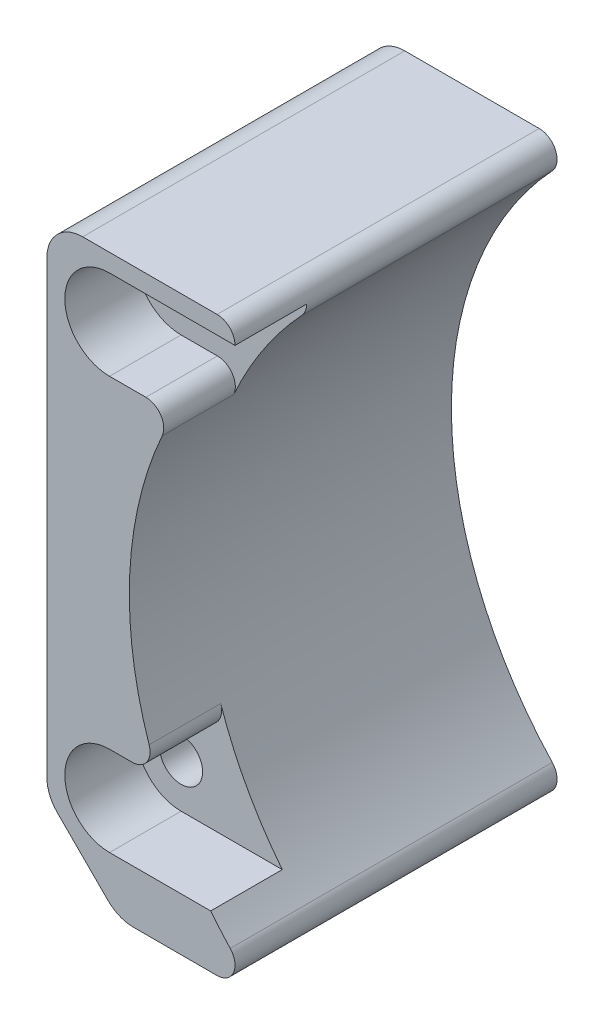
ISO-10303-21;
HEADER;
FILE_DESCRIPTION(('STEP AP214'),'2;1');
FILE_NAME('part.step','',(''),(''),'','','');
FILE_SCHEMA(('AUTOMOTIVE_DESIGN { 1 0 10303 214 1 1 1 1 }'));
ENDSEC;
DATA;
#1=APPLICATION_CONTEXT('core data for automotive mechanical design processes');
#2=APPLICATION_PROTOCOL_DEFINITION('international standard','automotive_design',2000,#1);
#3=PRODUCT_CONTEXT('',#1,'mechanical');
#4=PRODUCT('Part','Part','',(#3));
#5=PRODUCT_RELATED_PRODUCT_CATEGORY('part','',(#4));
#6=PRODUCT_DEFINITION_FORMATION('','',#4);
#7=PRODUCT_DEFINITION_CONTEXT('part definition',#1,'design');
#8=PRODUCT_DEFINITION('design','',#6,#7);
#9=PRODUCT_DEFINITION_SHAPE('','',#8);
#10=(LENGTH_UNIT() NAMED_UNIT(*) SI_UNIT(.MILLI.,.METRE.));
#11=(NAMED_UNIT(*) PLANE_ANGLE_UNIT() SI_UNIT($,.RADIAN.));
#12=(NAMED_UNIT(*) SI_UNIT($,.STERADIAN.) SOLID_ANGLE_UNIT());
#13=UNCERTAINTY_MEASURE_WITH_UNIT(LENGTH_MEASURE(1.E-05),#10,'distance_accuracy_value','');
#14=(GEOMETRIC_REPRESENTATION_CONTEXT(3) GLOBAL_UNCERTAINTY_ASSIGNED_CONTEXT((#13)) GLOBAL_UNIT_ASSIGNED_CONTEXT((#10,
#11,#12)) REPRESENTATION_CONTEXT('',''));
#15=CARTESIAN_POINT('',(0.,0.,0.));
#16=DIRECTION('',(0.,0.,1.));
#17=DIRECTION('',(1.,0.,0.));
#18=AXIS2_PLACEMENT_3D('',#15,#16,#17);
#19=CARTESIAN_POINT('',(40.6490210514226,25.4,0.));
#20=DIRECTION('',(0.,0.,1.));
#21=DIRECTION('',(1.,0.,0.));
#22=AXIS2_PLACEMENT_3D('',#19,#20,#21);
#23=PLANE('',#22);
#24=CARTESIAN_POINT('',(5.5562499999999,45.24375,0.));
#25=DIRECTION('',(0.,0.,1.));
#26=DIRECTION('',(1.,0.,0.));
#27=AXIS2_PLACEMENT_3D('',#24,#25,#26);
#28=CIRCLE('',#27,1.905);
#29=CARTESIAN_POINT('',(7.4612499999999,45.24375,0.));
#30=VERTEX_POINT('',#29);
#31=EDGE_CURVE('E238',#30,#30,#28,.T.);
#32=ORIENTED_EDGE('',*,*,#31,.T.);
#33=EDGE_LOOP('',(#32));
#34=FACE_BOUND('',#33,.T.);
#35=CARTESIAN_POINT('',(5.5562499999999,8.65147410593553,0.));
#36=DIRECTION('',(0.,0.,1.));
#37=DIRECTION('',(1.,0.,0.));
#38=AXIS2_PLACEMENT_3D('',#35,#36,#37);
#39=CIRCLE('',#38,1.905);
#40=CARTESIAN_POINT('',(7.4612499999999,8.65147410593553,0.));
#41=VERTEX_POINT('',#40);
#42=EDGE_CURVE('E242',#41,#41,#39,.T.);
#43=ORIENTED_EDGE('',*,*,#42,.T.);
#44=EDGE_LOOP('',(#43));
#45=FACE_BOUND('',#44,.T.);
#46=CARTESIAN_POINT('',(40.6490210514226,25.4,0.));
#47=DIRECTION('',(0.,0.,-1.));
#48=DIRECTION('',(1.,0.,0.));
#49=AXIS2_PLACEMENT_3D('',#46,#47,#48);
#50=CIRCLE('',#49,33.3375);
#51=CARTESIAN_POINT('',(16.2619170755915,2.66988636363636,0.));
#52=VERTEX_POINT('',#51);
#53=CARTESIAN_POINT('',(16.2619170755916,48.1301136363636,0.));
#54=VERTEX_POINT('',#53);
#55=EDGE_CURVE('E262',#52,#54,#50,.T.);
#56=ORIENTED_EDGE('',*,*,#55,.F.);
#57=CARTESIAN_POINT('',(15.1006264100758,1.5875,0.));
#58=DIRECTION('',(0.,0.,1.));
#59=DIRECTION('',(1.,0.,0.));
#60=AXIS2_PLACEMENT_3D('',#57,#58,#59);
#61=CIRCLE('',#60,1.5875);
#62=CARTESIAN_POINT('',(15.1006264100758,0.,0.));
#63=VERTEX_POINT('',#62);
#64=EDGE_CURVE('E314',#52,#63,#61,.F.);
#65=ORIENTED_EDGE('',*,*,#64,.T.);
#66=DIRECTION('',(1.,0.,0.));
#67=VECTOR('',#66,1.);
#68=CARTESIAN_POINT('',(0.,0.,0.));
#69=LINE('',#68,#67);
#70=CARTESIAN_POINT('',(7.66512806053459,0.,0.));
#71=VERTEX_POINT('',#70);
#72=EDGE_CURVE('E259',#71,#63,#69,.T.);
#73=ORIENTED_EDGE('',*,*,#72,.F.);
#74=CARTESIAN_POINT('',(7.66512806053459,3.175,0.));
#75=DIRECTION('',(0.,0.,1.));
#76=DIRECTION('',(1.,0.,0.));
#77=AXIS2_PLACEMENT_3D('',#74,#75,#76);
#78=CIRCLE('',#77,3.175);
#79=CARTESIAN_POINT('',(5.4200640302673,0.929935969732715,0.));
#80=VERTEX_POINT('',#79);
#81=EDGE_CURVE('E282',#71,#80,#78,.F.);
#82=ORIENTED_EDGE('',*,*,#81,.T.);
#83=DIRECTION('',(0.707106781186547,-0.707106781186548,0.));
#84=VECTOR('',#83,1.);
#85=CARTESIAN_POINT('',(6.35000000000001,0.,0.));
#86=LINE('',#85,#84);
#87=CARTESIAN_POINT('',(0.92993596973271,5.42006403026731,0.));
#88=VERTEX_POINT('',#87);
#89=EDGE_CURVE('E256',#80,#88,#86,.F.);
#90=ORIENTED_EDGE('',*,*,#89,.T.);
#91=CARTESIAN_POINT('',(3.175,7.6651280605346,0.));
#92=DIRECTION('',(0.,0.,1.));
#93=DIRECTION('',(1.,0.,0.));
#94=AXIS2_PLACEMENT_3D('',#91,#92,#93);
#95=CIRCLE('',#94,3.175);
#96=CARTESIAN_POINT('',(0.,7.6651280605346,0.));
#97=VERTEX_POINT('',#96);
#98=EDGE_CURVE('E280',#88,#97,#95,.F.);
#99=ORIENTED_EDGE('',*,*,#98,.T.);
#100=DIRECTION('',(0.,-1.,0.));
#101=VECTOR('',#100,1.);
#102=CARTESIAN_POINT('',(0.,0.,0.));
#103=LINE('',#102,#101);
#104=CARTESIAN_POINT('',(0.,47.625,0.));
#105=VERTEX_POINT('',#104);
#106=EDGE_CURVE('E241',#105,#97,#103,.T.);
#107=ORIENTED_EDGE('',*,*,#106,.F.);
#108=CARTESIAN_POINT('',(3.175,47.625,0.));
#109=DIRECTION('',(0.,0.,1.));
#110=DIRECTION('',(1.,0.,0.));
#111=AXIS2_PLACEMENT_3D('',#108,#109,#110);
#112=CIRCLE('',#111,3.175);
#113=CARTESIAN_POINT('',(3.175,50.8,0.));
#114=VERTEX_POINT('',#113);
#115=EDGE_CURVE('E277',#105,#114,#112,.F.);
#116=ORIENTED_EDGE('',*,*,#115,.T.);
#117=DIRECTION('',(-1.,0.,0.));
#118=VECTOR('',#117,1.);
#119=CARTESIAN_POINT('',(0.,50.8,0.));
#120=LINE('',#119,#118);
#121=CARTESIAN_POINT('',(15.1006264100758,50.8,0.));
#122=VERTEX_POINT('',#121);
#123=EDGE_CURVE('E265',#122,#114,#120,.T.);
#124=ORIENTED_EDGE('',*,*,#123,.F.);
#125=CARTESIAN_POINT('',(15.1006264100758,49.2125,0.));
#126=DIRECTION('',(0.,0.,1.));
#127=DIRECTION('',(1.,0.,0.));
#128=AXIS2_PLACEMENT_3D('',#125,#126,#127);
#129=CIRCLE('',#128,1.5875);
#130=EDGE_CURVE('E312',#122,#54,#129,.F.);
#131=ORIENTED_EDGE('',*,*,#130,.T.);
#132=EDGE_LOOP('',(#56,#65,#73,#82,#90,#99,#107,#116,#124,#131));
#133=FACE_BOUND('',#132,.T.);
#134=ADVANCED_FACE('F41',(#34,#45,#133),#23,.F.);
#135=CARTESIAN_POINT('',(0.,50.8,82.8317719726059));
#136=DIRECTION('',(0.,-1.,0.));
#137=DIRECTION('',(1.,0.,0.));
#138=AXIS2_PLACEMENT_3D('',#135,#136,#137);
#139=PLANE('',#138);
#140=DIRECTION('',(1.,0.,0.));
#141=VECTOR('',#140,1.);
#142=CARTESIAN_POINT('',(1.89436506848221E-13,50.8,28.575));
#143=LINE('',#142,#141);
#144=CARTESIAN_POINT('',(3.175,50.8,28.575));
#145=VERTEX_POINT('',#144);
#146=CARTESIAN_POINT('',(15.1006264100758,50.8,28.5750000000001));
#147=VERTEX_POINT('',#146);
#148=EDGE_CURVE('E250',#145,#147,#143,.T.);
#149=ORIENTED_EDGE('',*,*,#148,.T.);
#150=DIRECTION('',(0.,0.,-1.));
#151=VECTOR('',#150,1.);
#152=CARTESIAN_POINT('',(15.1006264100758,50.8,82.8317719726059));
#153=LINE('',#152,#151);
#154=EDGE_CURVE('E322',#147,#122,#153,.T.);
#155=ORIENTED_EDGE('',*,*,#154,.T.);
#156=ORIENTED_EDGE('',*,*,#123,.T.);
#157=DIRECTION('',(0.,0.,-1.));
#158=VECTOR('',#157,1.);
#159=CARTESIAN_POINT('',(3.175,50.8,82.8317719726059));
#160=LINE('',#159,#158);
#161=EDGE_CURVE('E301',#114,#145,#160,.F.);
#162=ORIENTED_EDGE('',*,*,#161,.T.);
#163=EDGE_LOOP('',(#149,#155,#156,#162));
#164=FACE_BOUND('',#163,.T.);
#165=ADVANCED_FACE('F375',(#164),#139,.F.);
#166=CARTESIAN_POINT('',(40.6490210514226,25.4,82.8317719726059));
#167=DIRECTION('',(0.,0.,-1.));
#168=DIRECTION('',(-1.,0.,0.));
#169=AXIS2_PLACEMENT_3D('',#166,#167,#168);
#170=CYLINDRICAL_SURFACE('',#169,33.3375);
#171=CARTESIAN_POINT('',(40.6490210514226,25.4,28.5750000000001));
#172=DIRECTION('',(0.,0.,-1.));
#173=DIRECTION('',(-1.,0.,0.));
#174=AXIS2_PLACEMENT_3D('',#171,#172,#173);
#175=CIRCLE('',#174,33.3375);
#176=CARTESIAN_POINT('',(10.2287646008587,39.0380681818182,28.575));
#177=VERTEX_POINT('',#176);
#178=CARTESIAN_POINT('',(9.06974045381517,14.7164639193021,28.575));
#179=VERTEX_POINT('',#178);
#180=EDGE_CURVE('E249',#177,#179,#175,.F.);
#181=ORIENTED_EDGE('',*,*,#180,.T.);
#182=DIRECTION('',(0.,0.,-1.));
#183=VECTOR('',#182,1.);
#184=CARTESIAN_POINT('',(9.06974045381517,14.7164639193021,82.8317719726059));
#185=LINE('',#184,#183);
#186=CARTESIAN_POINT('',(9.06974045381517,14.7164639193021,22.2249999999962));
#187=VERTEX_POINT('',#186);
#188=EDGE_CURVE('E338',#179,#187,#185,.T.);
#189=ORIENTED_EDGE('',*,*,#188,.T.);
#190=CARTESIAN_POINT('',(40.6490210514226,25.4,22.2249999999966));
#191=DIRECTION('',(0.,0.,-1.));
#192=DIRECTION('',(-1.,0.,0.));
#193=AXIS2_PLACEMENT_3D('',#190,#191,#192);
#194=CIRCLE('',#193,33.3375);
#195=CARTESIAN_POINT('',(14.5303804708102,4.68272410593554,22.2249999999962));
#196=VERTEX_POINT('',#195);
#197=EDGE_CURVE('E64',#196,#187,#194,.T.);
#198=ORIENTED_EDGE('',*,*,#197,.F.);
#199=DIRECTION('',(0.,0.,1.));
#200=VECTOR('',#199,1.);
#201=CARTESIAN_POINT('',(14.5303804708102,4.68272410593554,4.60566586284226));
#202=LINE('',#201,#200);
#203=CARTESIAN_POINT('',(14.5303804708102,4.68272410593554,28.575));
#204=VERTEX_POINT('',#203);
#205=EDGE_CURVE('E219',#196,#204,#202,.T.);
#206=ORIENTED_EDGE('',*,*,#205,.T.);
#207=CARTESIAN_POINT('',(16.2619170755915,2.66988636363636,28.5750000000001));
#208=VERTEX_POINT('',#207);
#209=EDGE_CURVE('E246',#204,#208,#175,.F.);
#210=ORIENTED_EDGE('',*,*,#209,.T.);
#211=DIRECTION('',(0.,0.,-1.));
#212=VECTOR('',#211,1.);
#213=CARTESIAN_POINT('',(16.2619170755915,2.66988636363636,82.8317719726059));
#214=LINE('',#213,#212);
#215=EDGE_CURVE('E309',#208,#52,#214,.T.);
#216=ORIENTED_EDGE('',*,*,#215,.T.);
#217=ORIENTED_EDGE('',*,*,#55,.T.);
#218=DIRECTION('',(0.,0.,-1.));
#219=VECTOR('',#218,1.);
#220=CARTESIAN_POINT('',(16.2619170755916,48.1301136363636,82.8317719726059));
#221=LINE('',#220,#219);
#222=CARTESIAN_POINT('',(16.2619170755916,48.1301136363636,22.2249999999963));
#223=VERTEX_POINT('',#222);
#224=EDGE_CURVE('E303',#54,#223,#221,.F.);
#225=ORIENTED_EDGE('',*,*,#224,.T.);
#226=CARTESIAN_POINT('',(40.6490210514226,25.4,22.2249999999966));
#227=DIRECTION('',(0.,0.,-1.));
#228=DIRECTION('',(-1.,0.,0.));
#229=AXIS2_PLACEMENT_3D('',#226,#227,#228);
#230=CIRCLE('',#229,33.3375);
#231=CARTESIAN_POINT('',(10.2287646008587,39.0380681818182,22.2249999999962));
#232=VERTEX_POINT('',#231);
#233=EDGE_CURVE('E209',#232,#223,#230,.T.);
#234=ORIENTED_EDGE('',*,*,#233,.F.);
#235=DIRECTION('',(0.,0.,-1.));
#236=VECTOR('',#235,1.);
#237=CARTESIAN_POINT('',(10.2287646008587,39.0380681818182,82.8317719726059));
#238=LINE('',#237,#236);
#239=EDGE_CURVE('E335',#232,#177,#238,.F.);
#240=ORIENTED_EDGE('',*,*,#239,.T.);
#241=EDGE_LOOP('',(#181,#189,#198,#206,#210,#216,#217,#225,#234,#240));
#242=FACE_BOUND('',#241,.T.);
#243=ADVANCED_FACE('F355',(#242),#170,.F.);
#244=CARTESIAN_POINT('',(0.,0.,82.8317719726059));
#245=DIRECTION('',(0.,1.,0.));
#246=DIRECTION('',(0.,0.,1.));
#247=AXIS2_PLACEMENT_3D('',#244,#245,#246);
#248=PLANE('',#247);
#249=ORIENTED_EDGE('',*,*,#72,.T.);
#250=DIRECTION('',(0.,0.,-1.));
#251=VECTOR('',#250,1.);
#252=CARTESIAN_POINT('',(15.1006264100758,0.,82.8317719726059));
#253=LINE('',#252,#251);
#254=CARTESIAN_POINT('',(15.1006264100758,0.,28.5750000000001));
#255=VERTEX_POINT('',#254);
#256=EDGE_CURVE('E316',#63,#255,#253,.F.);
#257=ORIENTED_EDGE('',*,*,#256,.T.);
#258=DIRECTION('',(-1.,0.,0.));
#259=VECTOR('',#258,1.);
#260=CARTESIAN_POINT('',(1.89436506848221E-13,0.,28.575));
#261=LINE('',#260,#259);
#262=CARTESIAN_POINT('',(7.66512806053459,0.,28.575));
#263=VERTEX_POINT('',#262);
#264=EDGE_CURVE('E251',#255,#263,#261,.T.);
#265=ORIENTED_EDGE('',*,*,#264,.T.);
#266=DIRECTION('',(0.,0.,1.));
#267=VECTOR('',#266,1.);
#268=CARTESIAN_POINT('',(7.66512806053459,0.,0.));
#269=LINE('',#268,#267);
#270=EDGE_CURVE('E274',#263,#71,#269,.F.);
#271=ORIENTED_EDGE('',*,*,#270,.T.);
#272=EDGE_LOOP('',(#249,#257,#265,#271));
#273=FACE_BOUND('',#272,.T.);
#274=ADVANCED_FACE('F410',(#273),#248,.F.);
#275=CARTESIAN_POINT('',(0.,0.,82.8317719726059));
#276=DIRECTION('',(1.,0.,0.));
#277=DIRECTION('',(0.,0.,-1.));
#278=AXIS2_PLACEMENT_3D('',#275,#276,#277);
#279=PLANE('',#278);
#280=ORIENTED_EDGE('',*,*,#106,.T.);
#281=DIRECTION('',(0.,0.,-1.));
#282=VECTOR('',#281,1.);
#283=CARTESIAN_POINT('',(0.,7.6651280605346,28.575));
#284=LINE('',#283,#282);
#285=CARTESIAN_POINT('',(0.,7.6651280605346,28.575));
#286=VERTEX_POINT('',#285);
#287=EDGE_CURVE('E298',#97,#286,#284,.F.);
#288=ORIENTED_EDGE('',*,*,#287,.T.);
#289=DIRECTION('',(0.,1.,0.));
#290=VECTOR('',#289,1.);
#291=CARTESIAN_POINT('',(0.,0.,28.575));
#292=LINE('',#291,#290);
#293=CARTESIAN_POINT('',(0.,47.625,28.575));
#294=VERTEX_POINT('',#293);
#295=EDGE_CURVE('E253',#286,#294,#292,.T.);
#296=ORIENTED_EDGE('',*,*,#295,.T.);
#297=DIRECTION('',(0.,0.,-1.));
#298=VECTOR('',#297,1.);
#299=CARTESIAN_POINT('',(0.,47.625,82.8317719726059));
#300=LINE('',#299,#298);
#301=EDGE_CURVE('E295',#294,#105,#300,.T.);
#302=ORIENTED_EDGE('',*,*,#301,.T.);
#303=EDGE_LOOP('',(#280,#288,#296,#302));
#304=FACE_BOUND('',#303,.T.);
#305=ADVANCED_FACE('F386',(#304),#279,.F.);
#306=CARTESIAN_POINT('',(-1.14281233996497E-13,0.,28.575));
#307=DIRECTION('',(0.,0.,-1.));
#308=DIRECTION('',(-1.,0.,0.));
#309=AXIS2_PLACEMENT_3D('',#306,#307,#308);
#310=PLANE('',#309);
#311=DIRECTION('',(-1.,0.,0.));
#312=VECTOR('',#311,1.);
#313=CARTESIAN_POINT('',(5.5562499999999,12.6202241059355,28.575));
#314=LINE('',#313,#312);
#315=CARTESIAN_POINT('',(7.56596518726244,12.6202241059355,28.575));
#316=VERTEX_POINT('',#315);
#317=CARTESIAN_POINT('',(5.5562499999999,12.6202241059355,28.575));
#318=VERTEX_POINT('',#317);
#319=EDGE_CURVE('E232',#316,#318,#314,.T.);
#320=ORIENTED_EDGE('',*,*,#319,.F.);
#321=CARTESIAN_POINT('',(7.56596518726244,14.2077241059355,28.575));
#322=DIRECTION('',(0.,0.,-1.));
#323=DIRECTION('',(-1.,0.,0.));
#324=AXIS2_PLACEMENT_3D('',#321,#322,#323);
#325=CIRCLE('',#324,1.5875);
#326=EDGE_CURVE('E333',#316,#179,#325,.F.);
#327=ORIENTED_EDGE('',*,*,#326,.T.);
#328=ORIENTED_EDGE('',*,*,#180,.F.);
#329=CARTESIAN_POINT('',(8.78018096035563,39.6875,28.575));
#330=DIRECTION('',(0.,0.,-1.));
#331=DIRECTION('',(-1.,0.,0.));
#332=AXIS2_PLACEMENT_3D('',#329,#330,#331);
#333=CIRCLE('',#332,1.5875);
#334=CARTESIAN_POINT('',(8.78018096035563,41.275,28.575));
#335=VERTEX_POINT('',#334);
#336=EDGE_CURVE('E203',#177,#335,#333,.F.);
#337=ORIENTED_EDGE('',*,*,#336,.T.);
#338=DIRECTION('',(1.,0.,0.));
#339=VECTOR('',#338,1.);
#340=CARTESIAN_POINT('',(5.5562499999999,41.275,28.575));
#341=LINE('',#340,#339);
#342=CARTESIAN_POINT('',(5.5562499999999,41.275,28.575));
#343=VERTEX_POINT('',#342);
#344=EDGE_CURVE('E182',#343,#335,#341,.T.);
#345=ORIENTED_EDGE('',*,*,#344,.F.);
#346=CARTESIAN_POINT('',(5.5562499999999,45.24375,28.575));
#347=DIRECTION('',(0.,0.,1.));
#348=DIRECTION('',(1.,0.,0.));
#349=AXIS2_PLACEMENT_3D('',#346,#347,#348);
#350=CIRCLE('',#349,3.96875);
#351=CARTESIAN_POINT('',(5.5562499999999,49.2125,28.575));
#352=VERTEX_POINT('',#351);
#353=EDGE_CURVE('E192',#352,#343,#350,.T.);
#354=ORIENTED_EDGE('',*,*,#353,.F.);
#355=DIRECTION('',(-1.,0.,0.));
#356=VECTOR('',#355,1.);
#357=CARTESIAN_POINT('',(5.5562499999999,49.2125,28.575));
#358=LINE('',#357,#356);
#359=CARTESIAN_POINT('',(16.6881264100758,49.2125,28.5750000000001));
#360=VERTEX_POINT('',#359);
#361=EDGE_CURVE('E204',#360,#352,#358,.T.);
#362=ORIENTED_EDGE('',*,*,#361,.F.);
#363=CARTESIAN_POINT('',(15.1006264100758,49.2125,28.5750000000001));
#364=DIRECTION('',(0.,0.,-1.));
#365=DIRECTION('',(-1.,0.,0.));
#366=AXIS2_PLACEMENT_3D('',#363,#364,#365);
#367=CIRCLE('',#366,1.5875);
#368=EDGE_CURVE('E318',#360,#147,#367,.F.);
#369=ORIENTED_EDGE('',*,*,#368,.T.);
#370=ORIENTED_EDGE('',*,*,#148,.F.);
#371=CARTESIAN_POINT('',(3.175,47.625,28.575));
#372=DIRECTION('',(0.,0.,-1.));
#373=DIRECTION('',(-1.,0.,0.));
#374=AXIS2_PLACEMENT_3D('',#371,#372,#373);
#375=CIRCLE('',#374,3.175);
#376=EDGE_CURVE('E288',#145,#294,#375,.F.);
#377=ORIENTED_EDGE('',*,*,#376,.T.);
#378=ORIENTED_EDGE('',*,*,#295,.F.);
#379=CARTESIAN_POINT('',(3.175,7.6651280605346,28.575));
#380=DIRECTION('',(0.,0.,-1.));
#381=DIRECTION('',(-1.,0.,0.));
#382=AXIS2_PLACEMENT_3D('',#379,#380,#381);
#383=CIRCLE('',#382,3.175);
#384=CARTESIAN_POINT('',(0.929935969732709,5.42006403026731,28.575));
#385=VERTEX_POINT('',#384);
#386=EDGE_CURVE('E290',#286,#385,#383,.F.);
#387=ORIENTED_EDGE('',*,*,#386,.T.);
#388=DIRECTION('',(-0.707106781186547,0.707106781186548,0.));
#389=VECTOR('',#388,1.);
#390=CARTESIAN_POINT('',(6.3500000000001,0.,28.575));
#391=LINE('',#390,#389);
#392=CARTESIAN_POINT('',(5.4200640302673,0.929935969732714,28.575));
#393=VERTEX_POINT('',#392);
#394=EDGE_CURVE('E271',#385,#393,#391,.F.);
#395=ORIENTED_EDGE('',*,*,#394,.T.);
#396=CARTESIAN_POINT('',(7.66512806053459,3.175,28.575));
#397=DIRECTION('',(0.,0.,-1.));
#398=DIRECTION('',(-1.,0.,0.));
#399=AXIS2_PLACEMENT_3D('',#396,#397,#398);
#400=CIRCLE('',#399,3.175);
#401=EDGE_CURVE('E292',#393,#263,#400,.F.);
#402=ORIENTED_EDGE('',*,*,#401,.T.);
#403=ORIENTED_EDGE('',*,*,#264,.F.);
#404=CARTESIAN_POINT('',(15.1006264100758,1.5875,28.5750000000001));
#405=DIRECTION('',(0.,0.,-1.));
#406=DIRECTION('',(-1.,0.,0.));
#407=AXIS2_PLACEMENT_3D('',#404,#405,#406);
#408=CIRCLE('',#407,1.5875);
#409=EDGE_CURVE('E320',#255,#208,#408,.F.);
#410=ORIENTED_EDGE('',*,*,#409,.T.);
#411=ORIENTED_EDGE('',*,*,#209,.F.);
#412=DIRECTION('',(1.,0.,0.));
#413=VECTOR('',#412,1.);
#414=CARTESIAN_POINT('',(5.5562499999999,4.68272410593553,28.575));
#415=LINE('',#414,#413);
#416=CARTESIAN_POINT('',(5.5562499999999,4.68272410593553,28.575));
#417=VERTEX_POINT('',#416);
#418=EDGE_CURVE('E235',#417,#204,#415,.T.);
#419=ORIENTED_EDGE('',*,*,#418,.F.);
#420=CARTESIAN_POINT('',(5.5562499999999,8.65147410593553,28.575));
#421=DIRECTION('',(0.,0.,1.));
#422=DIRECTION('',(1.,0.,0.));
#423=AXIS2_PLACEMENT_3D('',#420,#421,#422);
#424=CIRCLE('',#423,3.96875);
#425=EDGE_CURVE('E198',#318,#417,#424,.T.);
#426=ORIENTED_EDGE('',*,*,#425,.F.);
#427=EDGE_LOOP('',(#320,#327,#328,#337,#345,#354,#362,#369,#370,#377,#378,#387,#395,#402,#403,
#410,#411,#419,#426));
#428=FACE_BOUND('',#427,.T.);
#429=ADVANCED_FACE('F201',(#428),#310,.F.);
#430=CARTESIAN_POINT('',(6.35000000000001,0.,82.8317719726059));
#431=DIRECTION('',(0.707106781186548,0.707106781186547,0.));
#432=DIRECTION('',(0.,0.,-1.));
#433=AXIS2_PLACEMENT_3D('',#430,#431,#432);
#434=PLANE('',#433);
#435=ORIENTED_EDGE('',*,*,#89,.F.);
#436=DIRECTION('',(0.,0.,-1.));
#437=VECTOR('',#436,1.);
#438=CARTESIAN_POINT('',(5.4200640302673,0.929935969732714,28.575));
#439=LINE('',#438,#437);
#440=EDGE_CURVE('E286',#80,#393,#439,.F.);
#441=ORIENTED_EDGE('',*,*,#440,.T.);
#442=ORIENTED_EDGE('',*,*,#394,.F.);
#443=DIRECTION('',(0.,0.,1.));
#444=VECTOR('',#443,1.);
#445=CARTESIAN_POINT('',(0.92993596973271,5.42006403026731,0.));
#446=LINE('',#445,#444);
#447=EDGE_CURVE('E284',#385,#88,#446,.F.);
#448=ORIENTED_EDGE('',*,*,#447,.T.);
#449=EDGE_LOOP('',(#435,#441,#442,#448));
#450=FACE_BOUND('',#449,.T.);
#451=ADVANCED_FACE('F396',(#450),#434,.F.);
#452=CARTESIAN_POINT('',(5.5562499999999,8.65147410593553,0.));
#453=DIRECTION('',(0.,0.,1.));
#454=DIRECTION('',(1.,0.,0.));
#455=AXIS2_PLACEMENT_3D('',#452,#453,#454);
#456=CYLINDRICAL_SURFACE('',#455,1.905);
#457=CARTESIAN_POINT('',(5.5562499999999,8.65147410593553,22.2249999999962));
#458=DIRECTION('',(0.,0.,-1.));
#459=DIRECTION('',(-1.,0.,0.));
#460=AXIS2_PLACEMENT_3D('',#457,#458,#459);
#461=CIRCLE('',#460,1.905);
#462=CARTESIAN_POINT('',(7.4612499999999,8.65147410593553,22.2249999999962));
#463=VERTEX_POINT('',#462);
#464=EDGE_CURVE('E245',#463,#463,#461,.F.);
#465=CARTESIAN_POINT('',(7.4612499999999,8.65147410593553,22.2249999999962));
#466=CARTESIAN_POINT('',(7.4612499999999,8.65147410593553,21.9934895833296));
#467=CARTESIAN_POINT('',(7.4612499999999,8.65147410593553,21.761979166663));
#468=CARTESIAN_POINT('',(7.4612499999999,8.65147410593553,21.2989583333297));
#469=CARTESIAN_POINT('',(7.4612499999999,8.65147410593553,21.0674479166631));
#470=CARTESIAN_POINT('',(7.4612499999999,8.65147410593553,20.6044270833298));
#471=CARTESIAN_POINT('',(7.4612499999999,8.65147410593553,20.3729166666632));
#472=CARTESIAN_POINT('',(7.4612499999999,8.65147410593553,19.9098958333299));
#473=CARTESIAN_POINT('',(7.4612499999999,8.65147410593553,19.6783854166633));
#474=CARTESIAN_POINT('',(7.4612499999999,8.65147410593553,19.2153645833301));
#475=CARTESIAN_POINT('',(7.4612499999999,8.65147410593553,18.9838541666634));
#476=CARTESIAN_POINT('',(7.4612499999999,8.65147410593553,18.5208333333302));
#477=CARTESIAN_POINT('',(7.4612499999999,8.65147410593553,18.2893229166636));
#478=CARTESIAN_POINT('',(7.4612499999999,8.65147410593553,17.8263020833303));
#479=CARTESIAN_POINT('',(7.4612499999999,8.65147410593553,17.5947916666637));
#480=CARTESIAN_POINT('',(7.4612499999999,8.65147410593553,17.1317708333304));
#481=CARTESIAN_POINT('',(7.4612499999999,8.65147410593553,16.9002604166638));
#482=CARTESIAN_POINT('',(7.4612499999999,8.65147410593553,16.4372395833305));
#483=CARTESIAN_POINT('',(7.4612499999999,8.65147410593553,16.2057291666639));
#484=CARTESIAN_POINT('',(7.4612499999999,8.65147410593553,15.7427083333307));
#485=CARTESIAN_POINT('',(7.4612499999999,8.65147410593553,15.511197916664));
#486=CARTESIAN_POINT('',(7.4612499999999,8.65147410593553,15.0481770833308));
#487=CARTESIAN_POINT('',(7.4612499999999,8.65147410593553,14.8166666666641));
#488=CARTESIAN_POINT('',(7.4612499999999,8.65147410593553,14.3536458333309));
#489=CARTESIAN_POINT('',(7.4612499999999,8.65147410593553,14.1221354166643));
#490=CARTESIAN_POINT('',(7.4612499999999,8.65147410593553,13.659114583331));
#491=CARTESIAN_POINT('',(7.4612499999999,8.65147410593553,13.4276041666644));
#492=CARTESIAN_POINT('',(7.4612499999999,8.65147410593553,12.9645833333311));
#493=CARTESIAN_POINT('',(7.4612499999999,8.65147410593553,12.7330729166645));
#494=CARTESIAN_POINT('',(7.4612499999999,8.65147410593553,12.2700520833312));
#495=CARTESIAN_POINT('',(7.4612499999999,8.65147410593553,12.0385416666646));
#496=CARTESIAN_POINT('',(7.4612499999999,8.65147410593553,11.5755208333314));
#497=CARTESIAN_POINT('',(7.4612499999999,8.65147410593553,11.3440104166647));
#498=CARTESIAN_POINT('',(7.4612499999999,8.65147410593553,10.8809895833315));
#499=CARTESIAN_POINT('',(7.4612499999999,8.65147410593553,10.6494791666649));
#500=CARTESIAN_POINT('',(7.4612499999999,8.65147410593553,10.1864583333316));
#501=CARTESIAN_POINT('',(7.4612499999999,8.65147410593553,9.95494791666497));
#502=CARTESIAN_POINT('',(7.4612499999999,8.65147410593553,9.49192708333172));
#503=CARTESIAN_POINT('',(7.4612499999999,8.65147410593553,9.26041666666509));
#504=CARTESIAN_POINT('',(7.4612499999999,8.65147410593553,8.79739583333184));
#505=CARTESIAN_POINT('',(7.4612499999999,8.65147410593553,8.56588541666521));
#506=CARTESIAN_POINT('',(7.4612499999999,8.65147410593553,8.10286458333195));
#507=CARTESIAN_POINT('',(7.4612499999999,8.65147410593553,7.87135416666533));
#508=CARTESIAN_POINT('',(7.4612499999999,8.65147410593553,7.40833333333207));
#509=CARTESIAN_POINT('',(7.4612499999999,8.65147410593553,7.17682291666545));
#510=CARTESIAN_POINT('',(7.4612499999999,8.65147410593553,6.71380208333219));
#511=CARTESIAN_POINT('',(7.4612499999999,8.65147410593553,6.48229166666556));
#512=CARTESIAN_POINT('',(7.4612499999999,8.65147410593553,6.01927083333231));
#513=CARTESIAN_POINT('',(7.4612499999999,8.65147410593553,5.78776041666568));
#514=CARTESIAN_POINT('',(7.4612499999999,8.65147410593553,5.32473958333243));
#515=CARTESIAN_POINT('',(7.4612499999999,8.65147410593553,5.0932291666658));
#516=CARTESIAN_POINT('',(7.4612499999999,8.65147410593553,4.63020833333255));
#517=CARTESIAN_POINT('',(7.4612499999999,8.65147410593553,4.39869791666592));
#518=CARTESIAN_POINT('',(7.4612499999999,8.65147410593553,3.93567708333266));
#519=CARTESIAN_POINT('',(7.4612499999999,8.65147410593553,3.70416666666604));
#520=CARTESIAN_POINT('',(7.4612499999999,8.65147410593553,3.24114583333278));
#521=CARTESIAN_POINT('',(7.4612499999999,8.65147410593553,3.00963541666615));
#522=CARTESIAN_POINT('',(7.4612499999999,8.65147410593553,2.5466145833329));
#523=CARTESIAN_POINT('',(7.4612499999999,8.65147410593553,2.31510416666627));
#524=CARTESIAN_POINT('',(7.4612499999999,8.65147410593553,1.85208333333302));
#525=CARTESIAN_POINT('',(7.4612499999999,8.65147410593553,1.62057291666639));
#526=CARTESIAN_POINT('',(7.4612499999999,8.65147410593553,1.15755208333314));
#527=CARTESIAN_POINT('',(7.4612499999999,8.65147410593553,0.926041666666508));
#528=CARTESIAN_POINT('',(7.4612499999999,8.65147410593553,0.463020833333253));
#529=CARTESIAN_POINT('',(7.4612499999999,8.65147410593553,0.231510416666626));
#530=CARTESIAN_POINT('',(7.4612499999999,8.65147410593553,0.));
#531=B_SPLINE_CURVE_WITH_KNOTS('',3,(#465,#466,#467,#468,#469,#470,#471,#472,#473,#474,#475,
#476,#477,#478,#479,#480,#481,#482,#483,#484,#485,#486,#487,#488,#489,#490,#491,#492,#493,#494,
#495,#496,#497,#498,#499,#500,#501,#502,#503,#504,#505,#506,#507,#508,#509,#510,#511,#512,#513,
#514,#515,#516,#517,#518,#519,#520,#521,#522,#523,#524,#525,#526,#527,#528,#529,#530),
.UNSPECIFIED.,.F.,.F.,(4,2,2,2,2,2,2,2,2,2,2,2,2,2,2,2,2,2,2,2,2,2,2,2,2,2,2,2,2,2,2,2,4),(0.,
0.69453124999988,1.38906249999976,2.08359374999965,2.77812499999953,3.47265624999941,
4.16718749999929,4.86171874999917,5.55624999999906,6.25078124999894,6.94531249999882,
7.6398437499987,8.33437499999858,9.02890624999846,9.72343749999834,10.4179687499982,
11.1124999999981,11.807031249998,12.5015624999979,13.1960937499978,13.8906249999976,
14.5851562499975,15.2796874999974,15.9742187499973,16.6687499999972,17.363281249997,
18.0578124999969,18.7523437499968,19.4468749999967,20.1414062499966,20.8359374999965,
21.5304687499963,22.2249999999962),.UNSPECIFIED.);
#532=EDGE_CURVE('BSEAM432',#463,#41,#531,.T.);
#533=ORIENTED_EDGE('',*,*,#464,.T.);
#534=ORIENTED_EDGE('',*,*,#42,.F.);
#535=ORIENTED_EDGE('',*,*,#532,.T.);
#536=ORIENTED_EDGE('',*,*,#532,.F.);
#537=EDGE_LOOP('',(#533,#535,#534,#536));
#538=FACE_BOUND('',#537,.T.);
#539=ADVANCED_FACE('F432',(#538),#456,.F.);
#540=CARTESIAN_POINT('',(5.5562499999999,45.24375,0.));
#541=DIRECTION('',(0.,0.,1.));
#542=DIRECTION('',(1.,0.,0.));
#543=AXIS2_PLACEMENT_3D('',#540,#541,#542);
#544=CYLINDRICAL_SURFACE('',#543,1.905);
#545=CARTESIAN_POINT('',(5.5562499999999,45.24375,22.2249999999962));
#546=DIRECTION('',(0.,0.,-1.));
#547=DIRECTION('',(-1.,0.,0.));
#548=AXIS2_PLACEMENT_3D('',#545,#546,#547);
#549=CIRCLE('',#548,1.905);
#550=CARTESIAN_POINT('',(7.4612499999999,45.24375,22.2249999999962));
#551=VERTEX_POINT('',#550);
#552=EDGE_CURVE('E187',#551,#551,#549,.F.);
#553=CARTESIAN_POINT('',(7.4612499999999,45.24375,22.2249999999962));
#554=CARTESIAN_POINT('',(7.4612499999999,45.24375,21.9934895833296));
#555=CARTESIAN_POINT('',(7.4612499999999,45.24375,21.761979166663));
#556=CARTESIAN_POINT('',(7.4612499999999,45.24375,21.2989583333297));
#557=CARTESIAN_POINT('',(7.4612499999999,45.24375,21.0674479166631));
#558=CARTESIAN_POINT('',(7.4612499999999,45.24375,20.6044270833298));
#559=CARTESIAN_POINT('',(7.4612499999999,45.24375,20.3729166666632));
#560=CARTESIAN_POINT('',(7.4612499999999,45.24375,19.9098958333299));
#561=CARTESIAN_POINT('',(7.4612499999999,45.24375,19.6783854166633));
#562=CARTESIAN_POINT('',(7.4612499999999,45.24375,19.2153645833301));
#563=CARTESIAN_POINT('',(7.4612499999999,45.24375,18.9838541666634));
#564=CARTESIAN_POINT('',(7.4612499999999,45.24375,18.5208333333302));
#565=CARTESIAN_POINT('',(7.4612499999999,45.24375,18.2893229166636));
#566=CARTESIAN_POINT('',(7.4612499999999,45.24375,17.8263020833303));
#567=CARTESIAN_POINT('',(7.4612499999999,45.24375,17.5947916666637));
#568=CARTESIAN_POINT('',(7.4612499999999,45.24375,17.1317708333304));
#569=CARTESIAN_POINT('',(7.4612499999999,45.24375,16.9002604166638));
#570=CARTESIAN_POINT('',(7.4612499999999,45.24375,16.4372395833305));
#571=CARTESIAN_POINT('',(7.4612499999999,45.24375,16.2057291666639));
#572=CARTESIAN_POINT('',(7.4612499999999,45.24375,15.7427083333307));
#573=CARTESIAN_POINT('',(7.4612499999999,45.24375,15.511197916664));
#574=CARTESIAN_POINT('',(7.4612499999999,45.24375,15.0481770833308));
#575=CARTESIAN_POINT('',(7.4612499999999,45.24375,14.8166666666641));
#576=CARTESIAN_POINT('',(7.4612499999999,45.24375,14.3536458333309));
#577=CARTESIAN_POINT('',(7.4612499999999,45.24375,14.1221354166643));
#578=CARTESIAN_POINT('',(7.4612499999999,45.24375,13.659114583331));
#579=CARTESIAN_POINT('',(7.4612499999999,45.24375,13.4276041666644));
#580=CARTESIAN_POINT('',(7.4612499999999,45.24375,12.9645833333311));
#581=CARTESIAN_POINT('',(7.4612499999999,45.24375,12.7330729166645));
#582=CARTESIAN_POINT('',(7.4612499999999,45.24375,12.2700520833312));
#583=CARTESIAN_POINT('',(7.4612499999999,45.24375,12.0385416666646));
#584=CARTESIAN_POINT('',(7.4612499999999,45.24375,11.5755208333314));
#585=CARTESIAN_POINT('',(7.4612499999999,45.24375,11.3440104166647));
#586=CARTESIAN_POINT('',(7.4612499999999,45.24375,10.8809895833315));
#587=CARTESIAN_POINT('',(7.4612499999999,45.24375,10.6494791666649));
#588=CARTESIAN_POINT('',(7.4612499999999,45.24375,10.1864583333316));
#589=CARTESIAN_POINT('',(7.4612499999999,45.24375,9.95494791666497));
#590=CARTESIAN_POINT('',(7.4612499999999,45.24375,9.49192708333172));
#591=CARTESIAN_POINT('',(7.4612499999999,45.24375,9.26041666666509));
#592=CARTESIAN_POINT('',(7.4612499999999,45.24375,8.79739583333184));
#593=CARTESIAN_POINT('',(7.4612499999999,45.24375,8.56588541666521));
#594=CARTESIAN_POINT('',(7.4612499999999,45.24375,8.10286458333195));
#595=CARTESIAN_POINT('',(7.4612499999999,45.24375,7.87135416666533));
#596=CARTESIAN_POINT('',(7.4612499999999,45.24375,7.40833333333207));
#597=CARTESIAN_POINT('',(7.4612499999999,45.24375,7.17682291666545));
#598=CARTESIAN_POINT('',(7.4612499999999,45.24375,6.71380208333219));
#599=CARTESIAN_POINT('',(7.4612499999999,45.24375,6.48229166666556));
#600=CARTESIAN_POINT('',(7.4612499999999,45.24375,6.01927083333231));
#601=CARTESIAN_POINT('',(7.4612499999999,45.24375,5.78776041666568));
#602=CARTESIAN_POINT('',(7.4612499999999,45.24375,5.32473958333243));
#603=CARTESIAN_POINT('',(7.4612499999999,45.24375,5.0932291666658));
#604=CARTESIAN_POINT('',(7.4612499999999,45.24375,4.63020833333255));
#605=CARTESIAN_POINT('',(7.4612499999999,45.24375,4.39869791666592));
#606=CARTESIAN_POINT('',(7.4612499999999,45.24375,3.93567708333266));
#607=CARTESIAN_POINT('',(7.4612499999999,45.24375,3.70416666666604));
#608=CARTESIAN_POINT('',(7.4612499999999,45.24375,3.24114583333278));
#609=CARTESIAN_POINT('',(7.4612499999999,45.24375,3.00963541666615));
#610=CARTESIAN_POINT('',(7.4612499999999,45.24375,2.5466145833329));
#611=CARTESIAN_POINT('',(7.4612499999999,45.24375,2.31510416666627));
#612=CARTESIAN_POINT('',(7.4612499999999,45.24375,1.85208333333302));
#613=CARTESIAN_POINT('',(7.4612499999999,45.24375,1.62057291666639));
#614=CARTESIAN_POINT('',(7.4612499999999,45.24375,1.15755208333314));
#615=CARTESIAN_POINT('',(7.4612499999999,45.24375,0.926041666666508));
#616=CARTESIAN_POINT('',(7.4612499999999,45.24375,0.463020833333253));
#617=CARTESIAN_POINT('',(7.4612499999999,45.24375,0.231510416666626));
#618=CARTESIAN_POINT('',(7.4612499999999,45.24375,0.));
#619=B_SPLINE_CURVE_WITH_KNOTS('',3,(#553,#554,#555,#556,#557,#558,#559,#560,#561,#562,#563,
#564,#565,#566,#567,#568,#569,#570,#571,#572,#573,#574,#575,#576,#577,#578,#579,#580,#581,#582,
#583,#584,#585,#586,#587,#588,#589,#590,#591,#592,#593,#594,#595,#596,#597,#598,#599,#600,#601,
#602,#603,#604,#605,#606,#607,#608,#609,#610,#611,#612,#613,#614,#615,#616,#617,#618),
.UNSPECIFIED.,.F.,.F.,(4,2,2,2,2,2,2,2,2,2,2,2,2,2,2,2,2,2,2,2,2,2,2,2,2,2,2,2,2,2,2,2,4),(0.,
0.69453124999988,1.38906249999976,2.08359374999965,2.77812499999953,3.47265624999941,
4.16718749999929,4.86171874999917,5.55624999999906,6.25078124999894,6.94531249999882,
7.6398437499987,8.33437499999858,9.02890624999846,9.72343749999834,10.4179687499982,
11.1124999999981,11.807031249998,12.5015624999979,13.1960937499978,13.8906249999976,
14.5851562499975,15.2796874999974,15.9742187499973,16.6687499999972,17.363281249997,
18.0578124999969,18.7523437499968,19.4468749999967,20.1414062499966,20.8359374999965,
21.5304687499963,22.2249999999962),.UNSPECIFIED.);
#620=EDGE_CURVE('BSEAM435',#551,#30,#619,.T.);
#621=ORIENTED_EDGE('',*,*,#552,.T.);
#622=ORIENTED_EDGE('',*,*,#31,.F.);
#623=ORIENTED_EDGE('',*,*,#620,.T.);
#624=ORIENTED_EDGE('',*,*,#620,.F.);
#625=EDGE_LOOP('',(#621,#623,#622,#624));
#626=FACE_BOUND('',#625,.T.);
#627=ADVANCED_FACE('F435',(#626),#544,.F.);
#628=CARTESIAN_POINT('',(7.66512806053459,3.175,82.8317719726059));
#629=DIRECTION('',(0.,0.,-1.));
#630=DIRECTION('',(-1.,0.,0.));
#631=AXIS2_PLACEMENT_3D('',#628,#629,#630);
#632=CYLINDRICAL_SURFACE('',#631,3.175);
#633=ORIENTED_EDGE('',*,*,#401,.F.);
#634=ORIENTED_EDGE('',*,*,#440,.F.);
#635=ORIENTED_EDGE('',*,*,#81,.F.);
#636=ORIENTED_EDGE('',*,*,#270,.F.);
#637=EDGE_LOOP('',(#633,#634,#635,#636));
#638=FACE_BOUND('',#637,.T.);
#639=ADVANCED_FACE('F399',(#638),#632,.T.);
#640=CARTESIAN_POINT('',(3.175,7.6651280605346,82.8317719726059));
#641=DIRECTION('',(0.,0.,1.));
#642=DIRECTION('',(1.,0.,0.));
#643=AXIS2_PLACEMENT_3D('',#640,#641,#642);
#644=CYLINDRICAL_SURFACE('',#643,3.175);
#645=ORIENTED_EDGE('',*,*,#98,.F.);
#646=ORIENTED_EDGE('',*,*,#447,.F.);
#647=ORIENTED_EDGE('',*,*,#386,.F.);
#648=ORIENTED_EDGE('',*,*,#287,.F.);
#649=EDGE_LOOP('',(#645,#646,#647,#648));
#650=FACE_BOUND('',#649,.T.);
#651=ADVANCED_FACE('F390',(#650),#644,.T.);
#652=CARTESIAN_POINT('',(3.175,47.625,82.8317719726059));
#653=DIRECTION('',(0.,0.,-1.));
#654=DIRECTION('',(-1.,0.,0.));
#655=AXIS2_PLACEMENT_3D('',#652,#653,#654);
#656=CYLINDRICAL_SURFACE('',#655,3.175);
#657=ORIENTED_EDGE('',*,*,#376,.F.);
#658=ORIENTED_EDGE('',*,*,#161,.F.);
#659=ORIENTED_EDGE('',*,*,#115,.F.);
#660=ORIENTED_EDGE('',*,*,#301,.F.);
#661=EDGE_LOOP('',(#657,#658,#659,#660));
#662=FACE_BOUND('',#661,.T.);
#663=ADVANCED_FACE('F383',(#662),#656,.T.);
#664=CARTESIAN_POINT('',(40.6490210514225,25.4,22.2249999999966));
#665=DIRECTION('',(0.,0.,-1.));
#666=DIRECTION('',(-1.,0.,0.));
#667=AXIS2_PLACEMENT_3D('',#664,#665,#666);
#668=PLANE('',#667);
#669=ORIENTED_EDGE('',*,*,#233,.T.);
#670=CARTESIAN_POINT('',(15.1006264100758,49.2125,22.2249999999963));
#671=DIRECTION('',(0.,0.,-1.));
#672=DIRECTION('',(-1.,0.,0.));
#673=AXIS2_PLACEMENT_3D('',#670,#671,#672);
#674=CIRCLE('',#673,1.5875);
#675=CARTESIAN_POINT('',(16.6881264100758,49.2125,22.2249999999963));
#676=VERTEX_POINT('',#675);
#677=EDGE_CURVE('E325',#223,#676,#674,.F.);
#678=ORIENTED_EDGE('',*,*,#677,.T.);
#679=DIRECTION('',(-1.,0.,0.));
#680=VECTOR('',#679,1.);
#681=CARTESIAN_POINT('',(5.55624999999971,49.2125,22.2249999999962));
#682=LINE('',#681,#680);
#683=CARTESIAN_POINT('',(5.5562499999999,49.2125,22.2249999999962));
#684=VERTEX_POINT('',#683);
#685=EDGE_CURVE('E211',#676,#684,#682,.T.);
#686=ORIENTED_EDGE('',*,*,#685,.T.);
#687=CARTESIAN_POINT('',(5.5562499999999,45.24375,22.2249999999962));
#688=DIRECTION('',(0.,0.,-1.));
#689=DIRECTION('',(-1.,0.,0.));
#690=AXIS2_PLACEMENT_3D('',#687,#688,#689);
#691=CIRCLE('',#690,3.96875);
#692=CARTESIAN_POINT('',(5.5562499999999,41.275,22.2249999999962));
#693=VERTEX_POINT('',#692);
#694=EDGE_CURVE('E188',#684,#693,#691,.F.);
#695=ORIENTED_EDGE('',*,*,#694,.T.);
#696=DIRECTION('',(1.,0.,0.));
#697=VECTOR('',#696,1.);
#698=CARTESIAN_POINT('',(5.55624999999972,41.275,22.2249999999962));
#699=LINE('',#698,#697);
#700=CARTESIAN_POINT('',(8.78018096035563,41.275,22.2249999999962));
#701=VERTEX_POINT('',#700);
#702=EDGE_CURVE('E183',#693,#701,#699,.T.);
#703=ORIENTED_EDGE('',*,*,#702,.T.);
#704=CARTESIAN_POINT('',(8.78018096035563,39.6875,22.2249999999962));
#705=DIRECTION('',(0.,0.,-1.));
#706=DIRECTION('',(-1.,0.,0.));
#707=AXIS2_PLACEMENT_3D('',#704,#705,#706);
#708=CIRCLE('',#707,1.5875);
#709=EDGE_CURVE('E11',#701,#232,#708,.T.);
#710=ORIENTED_EDGE('',*,*,#709,.T.);
#711=EDGE_LOOP('',(#669,#678,#686,#695,#703,#710));
#712=FACE_BOUND('',#711,.T.);
#713=ORIENTED_EDGE('',*,*,#552,.F.);
#714=EDGE_LOOP('',(#713));
#715=FACE_BOUND('',#714,.T.);
#716=ADVANCED_FACE('F360',(#712,#715),#668,.F.);
#717=CARTESIAN_POINT('',(5.5562499999999,41.275,4.60566586284226));
#718=DIRECTION('',(0.,-1.,0.));
#719=DIRECTION('',(0.,0.,-1.));
#720=AXIS2_PLACEMENT_3D('',#717,#718,#719);
#721=PLANE('',#720);
#722=ORIENTED_EDGE('',*,*,#344,.T.);
#723=DIRECTION('',(0.,0.,-1.));
#724=VECTOR('',#723,1.);
#725=CARTESIAN_POINT('',(8.78018096035563,41.275,4.60566586284226));
#726=LINE('',#725,#724);
#727=EDGE_CURVE('E56',#335,#701,#726,.T.);
#728=ORIENTED_EDGE('',*,*,#727,.T.);
#729=ORIENTED_EDGE('',*,*,#702,.F.);
#730=DIRECTION('',(0.,0.,1.));
#731=VECTOR('',#730,1.);
#732=CARTESIAN_POINT('',(5.5562499999999,41.275,4.60566586284226));
#733=LINE('',#732,#731);
#734=EDGE_CURVE('E178',#693,#343,#733,.T.);
#735=ORIENTED_EDGE('',*,*,#734,.T.);
#736=EDGE_LOOP('',(#722,#728,#729,#735));
#737=FACE_BOUND('',#736,.T.);
#738=ADVANCED_FACE('F180',(#737),#721,.F.);
#739=CARTESIAN_POINT('',(5.5562499999999,49.2125,4.60566586284226));
#740=DIRECTION('',(0.,1.,0.));
#741=DIRECTION('',(0.,0.,1.));
#742=AXIS2_PLACEMENT_3D('',#739,#740,#741);
#743=PLANE('',#742);
#744=ORIENTED_EDGE('',*,*,#685,.F.);
#745=DIRECTION('',(0.,0.,-1.));
#746=VECTOR('',#745,1.);
#747=CARTESIAN_POINT('',(16.6881264100758,49.2125,22.2249999999963));
#748=LINE('',#747,#746);
#749=EDGE_CURVE('E327',#676,#360,#748,.F.);
#750=ORIENTED_EDGE('',*,*,#749,.T.);
#751=ORIENTED_EDGE('',*,*,#361,.T.);
#752=DIRECTION('',(0.,0.,1.));
#753=VECTOR('',#752,1.);
#754=CARTESIAN_POINT('',(5.5562499999999,49.2125,4.60566586284226));
#755=LINE('',#754,#753);
#756=EDGE_CURVE('E195',#684,#352,#755,.T.);
#757=ORIENTED_EDGE('',*,*,#756,.F.);
#758=EDGE_LOOP('',(#744,#750,#751,#757));
#759=FACE_BOUND('',#758,.T.);
#760=ADVANCED_FACE('F365',(#759),#743,.F.);
#761=CARTESIAN_POINT('',(5.5562499999999,45.24375,4.60566586284226));
#762=DIRECTION('',(0.,0.,1.));
#763=DIRECTION('',(1.,0.,0.));
#764=AXIS2_PLACEMENT_3D('',#761,#762,#763);
#765=CYLINDRICAL_SURFACE('',#764,3.96875);
#766=ORIENTED_EDGE('',*,*,#756,.T.);
#767=ORIENTED_EDGE('',*,*,#353,.T.);
#768=ORIENTED_EDGE('',*,*,#734,.F.);
#769=ORIENTED_EDGE('',*,*,#694,.F.);
#770=EDGE_LOOP('',(#766,#767,#768,#769));
#771=FACE_BOUND('',#770,.T.);
#772=ADVANCED_FACE('F193',(#771),#765,.F.);
#773=CARTESIAN_POINT('',(40.6490210514225,25.4,22.2249999999966));
#774=DIRECTION('',(0.,0.,-1.));
#775=DIRECTION('',(-1.,0.,0.));
#776=AXIS2_PLACEMENT_3D('',#773,#774,#775);
#777=PLANE('',#776);
#778=CARTESIAN_POINT('',(5.5562499999999,8.65147410593553,22.2249999999962));
#779=DIRECTION('',(0.,0.,-1.));
#780=DIRECTION('',(-1.,0.,0.));
#781=AXIS2_PLACEMENT_3D('',#778,#779,#780);
#782=CIRCLE('',#781,3.96875);
#783=CARTESIAN_POINT('',(5.5562499999999,12.6202241059355,22.2249999999962));
#784=VERTEX_POINT('',#783);
#785=CARTESIAN_POINT('',(5.5562499999999,4.68272410593553,22.2249999999962));
#786=VERTEX_POINT('',#785);
#787=EDGE_CURVE('E218',#784,#786,#782,.F.);
#788=ORIENTED_EDGE('',*,*,#787,.T.);
#789=DIRECTION('',(1.,0.,0.));
#790=VECTOR('',#789,1.);
#791=CARTESIAN_POINT('',(5.55624999999972,4.68272410593553,22.2249999999962));
#792=LINE('',#791,#790);
#793=EDGE_CURVE('E222',#786,#196,#792,.T.);
#794=ORIENTED_EDGE('',*,*,#793,.T.);
#795=ORIENTED_EDGE('',*,*,#197,.T.);
#796=CARTESIAN_POINT('',(7.56596518726244,14.2077241059355,22.2249999999962));
#797=DIRECTION('',(0.,0.,-1.));
#798=DIRECTION('',(-1.,0.,0.));
#799=AXIS2_PLACEMENT_3D('',#796,#797,#798);
#800=CIRCLE('',#799,1.5875);
#801=CARTESIAN_POINT('',(7.56596518726244,12.6202241059355,22.2249999999962));
#802=VERTEX_POINT('',#801);
#803=EDGE_CURVE('E49',#187,#802,#800,.T.);
#804=ORIENTED_EDGE('',*,*,#803,.T.);
#805=DIRECTION('',(-1.,0.,0.));
#806=VECTOR('',#805,1.);
#807=CARTESIAN_POINT('',(5.55624999999971,12.6202241059355,22.2249999999962));
#808=LINE('',#807,#806);
#809=EDGE_CURVE('E226',#802,#784,#808,.T.);
#810=ORIENTED_EDGE('',*,*,#809,.T.);
#811=EDGE_LOOP('',(#788,#794,#795,#804,#810));
#812=FACE_BOUND('',#811,.T.);
#813=ORIENTED_EDGE('',*,*,#464,.F.);
#814=EDGE_LOOP('',(#813));
#815=FACE_BOUND('',#814,.T.);
#816=ADVANCED_FACE('F342',(#812,#815),#777,.F.);
#817=CARTESIAN_POINT('',(5.5562499999999,4.68272410593553,4.60566586284226));
#818=DIRECTION('',(0.,-1.,0.));
#819=DIRECTION('',(0.,0.,-1.));
#820=AXIS2_PLACEMENT_3D('',#817,#818,#819);
#821=PLANE('',#820);
#822=DIRECTION('',(0.,0.,1.));
#823=VECTOR('',#822,1.);
#824=CARTESIAN_POINT('',(5.5562499999999,4.68272410593553,4.60566586284226));
#825=LINE('',#824,#823);
#826=EDGE_CURVE('E216',#786,#417,#825,.T.);
#827=ORIENTED_EDGE('',*,*,#826,.T.);
#828=ORIENTED_EDGE('',*,*,#418,.T.);
#829=ORIENTED_EDGE('',*,*,#205,.F.);
#830=ORIENTED_EDGE('',*,*,#793,.F.);
#831=EDGE_LOOP('',(#827,#828,#829,#830));
#832=FACE_BOUND('',#831,.T.);
#833=ADVANCED_FACE('F445',(#832),#821,.F.);
#834=CARTESIAN_POINT('',(5.5562499999999,12.6202241059355,4.60566586284226));
#835=DIRECTION('',(0.,1.,0.));
#836=DIRECTION('',(0.,0.,1.));
#837=AXIS2_PLACEMENT_3D('',#834,#835,#836);
#838=PLANE('',#837);
#839=ORIENTED_EDGE('',*,*,#809,.F.);
#840=DIRECTION('',(0.,0.,-1.));
#841=VECTOR('',#840,1.);
#842=CARTESIAN_POINT('',(7.56596518726244,12.6202241059355,4.60566586284226));
#843=LINE('',#842,#841);
#844=EDGE_CURVE('E329',#802,#316,#843,.F.);
#845=ORIENTED_EDGE('',*,*,#844,.T.);
#846=ORIENTED_EDGE('',*,*,#319,.T.);
#847=DIRECTION('',(0.,0.,1.));
#848=VECTOR('',#847,1.);
#849=CARTESIAN_POINT('',(5.5562499999999,12.6202241059355,4.60566586284226));
#850=LINE('',#849,#848);
#851=EDGE_CURVE('E223',#784,#318,#850,.T.);
#852=ORIENTED_EDGE('',*,*,#851,.F.);
#853=EDGE_LOOP('',(#839,#845,#846,#852));
#854=FACE_BOUND('',#853,.T.);
#855=ADVANCED_FACE('F350',(#854),#838,.F.);
#856=CARTESIAN_POINT('',(5.5562499999999,8.65147410593553,4.60566586284226));
#857=DIRECTION('',(0.,0.,1.));
#858=DIRECTION('',(1.,0.,0.));
#859=AXIS2_PLACEMENT_3D('',#856,#857,#858);
#860=CYLINDRICAL_SURFACE('',#859,3.96875);
#861=ORIENTED_EDGE('',*,*,#851,.T.);
#862=ORIENTED_EDGE('',*,*,#425,.T.);
#863=ORIENTED_EDGE('',*,*,#826,.F.);
#864=ORIENTED_EDGE('',*,*,#787,.F.);
#865=EDGE_LOOP('',(#861,#862,#863,#864));
#866=FACE_BOUND('',#865,.T.);
#867=ADVANCED_FACE('F440',(#866),#860,.F.);
#868=CARTESIAN_POINT('',(15.1006264100758,1.5875,82.8317719726059));
#869=DIRECTION('',(0.,0.,-1.));
#870=DIRECTION('',(-1.,0.,0.));
#871=AXIS2_PLACEMENT_3D('',#868,#869,#870);
#872=CYLINDRICAL_SURFACE('',#871,1.5875);
#873=ORIENTED_EDGE('',*,*,#409,.F.);
#874=ORIENTED_EDGE('',*,*,#256,.F.);
#875=ORIENTED_EDGE('',*,*,#64,.F.);
#876=ORIENTED_EDGE('',*,*,#215,.F.);
#877=EDGE_LOOP('',(#873,#874,#875,#876));
#878=FACE_BOUND('',#877,.T.);
#879=ADVANCED_FACE('F408',(#878),#872,.T.);
#880=CARTESIAN_POINT('',(15.1006264100758,49.2125,82.8317719726059));
#881=DIRECTION('',(0.,0.,-1.));
#882=DIRECTION('',(-1.,0.,0.));
#883=AXIS2_PLACEMENT_3D('',#880,#881,#882);
#884=CYLINDRICAL_SURFACE('',#883,1.5875);
#885=ORIENTED_EDGE('',*,*,#677,.F.);
#886=ORIENTED_EDGE('',*,*,#224,.F.);
#887=ORIENTED_EDGE('',*,*,#130,.F.);
#888=ORIENTED_EDGE('',*,*,#154,.F.);
#889=ORIENTED_EDGE('',*,*,#368,.F.);
#890=ORIENTED_EDGE('',*,*,#749,.F.);
#891=EDGE_LOOP('',(#885,#886,#887,#888,#889,#890));
#892=FACE_BOUND('',#891,.T.);
#893=ADVANCED_FACE('F371',(#892),#884,.T.);
#894=CARTESIAN_POINT('',(7.56596518726244,14.2077241059355,82.8317719726059));
#895=DIRECTION('',(0.,0.,-1.));
#896=DIRECTION('',(-1.,0.,0.));
#897=AXIS2_PLACEMENT_3D('',#894,#895,#896);
#898=CYLINDRICAL_SURFACE('',#897,1.5875);
#899=ORIENTED_EDGE('',*,*,#803,.F.);
#900=ORIENTED_EDGE('',*,*,#188,.F.);
#901=ORIENTED_EDGE('',*,*,#326,.F.);
#902=ORIENTED_EDGE('',*,*,#844,.F.);
#903=EDGE_LOOP('',(#899,#900,#901,#902));
#904=FACE_BOUND('',#903,.T.);
#905=ADVANCED_FACE('F351',(#904),#898,.T.);
#906=CARTESIAN_POINT('',(8.78018096035563,39.6875,82.8317719726059));
#907=DIRECTION('',(0.,0.,-1.));
#908=DIRECTION('',(-1.,0.,0.));
#909=AXIS2_PLACEMENT_3D('',#906,#907,#908);
#910=CYLINDRICAL_SURFACE('',#909,1.5875);
#911=ORIENTED_EDGE('',*,*,#709,.F.);
#912=ORIENTED_EDGE('',*,*,#727,.F.);
#913=ORIENTED_EDGE('',*,*,#336,.F.);
#914=ORIENTED_EDGE('',*,*,#239,.F.);
#915=EDGE_LOOP('',(#911,#912,#913,#914));
#916=FACE_BOUND('',#915,.T.);
#917=ADVANCED_FACE('F43',(#916),#910,.T.);
#918=CLOSED_SHELL('',(#134,#165,#243,#274,#305,#429,#451,#539,#627,#639,#651,#663,#716,#738,
#760,#772,#816,#833,#855,#867,#879,#893,#905,#917));
#919=MANIFOLD_SOLID_BREP('B2',#918);
#920=ADVANCED_BREP_SHAPE_REPRESENTATION('',(#18,#919),#14);
#921=SHAPE_DEFINITION_REPRESENTATION(#9,#920);
ENDSEC;
END-ISO-10303-21;
